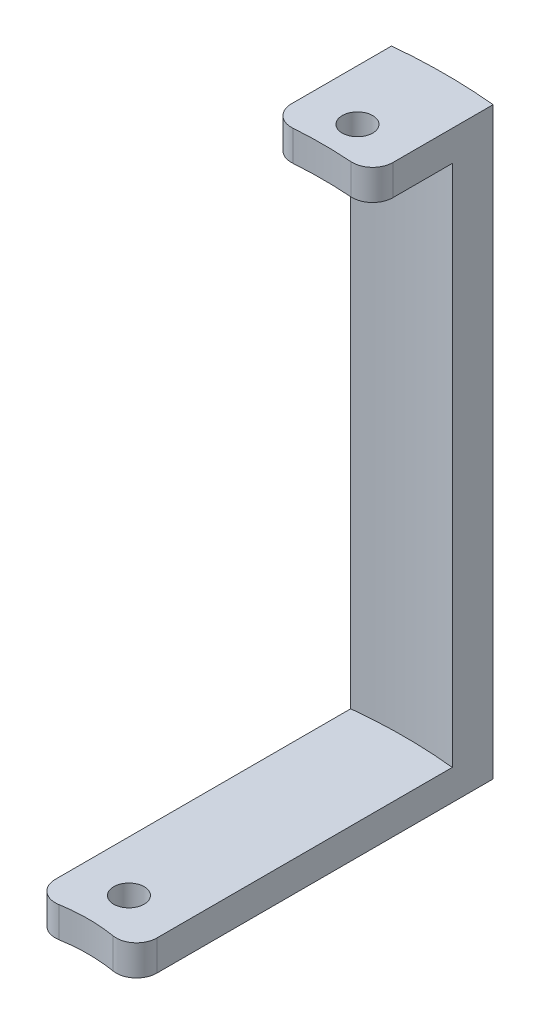
ISO-10303-21;
HEADER;
FILE_DESCRIPTION(('STEP AP214'),'2;1');
FILE_NAME('part.step','',(''),(''),'','','');
FILE_SCHEMA(('AUTOMOTIVE_DESIGN { 1 0 10303 214 1 1 1 1 }'));
ENDSEC;
DATA;
#1=APPLICATION_CONTEXT('core data for automotive mechanical design processes');
#2=APPLICATION_PROTOCOL_DEFINITION('international standard','automotive_design',2000,#1);
#3=PRODUCT_CONTEXT('',#1,'mechanical');
#4=PRODUCT('Part','Part','',(#3));
#5=PRODUCT_RELATED_PRODUCT_CATEGORY('part','',(#4));
#6=PRODUCT_DEFINITION_FORMATION('','',#4);
#7=PRODUCT_DEFINITION_CONTEXT('part definition',#1,'design');
#8=PRODUCT_DEFINITION('design','',#6,#7);
#9=PRODUCT_DEFINITION_SHAPE('','',#8);
#10=(LENGTH_UNIT() NAMED_UNIT(*) SI_UNIT(.MILLI.,.METRE.));
#11=(NAMED_UNIT(*) PLANE_ANGLE_UNIT() SI_UNIT($,.RADIAN.));
#12=(NAMED_UNIT(*) SI_UNIT($,.STERADIAN.) SOLID_ANGLE_UNIT());
#13=UNCERTAINTY_MEASURE_WITH_UNIT(LENGTH_MEASURE(1.E-05),#10,'distance_accuracy_value','');
#14=(GEOMETRIC_REPRESENTATION_CONTEXT(3) GLOBAL_UNCERTAINTY_ASSIGNED_CONTEXT((#13)) GLOBAL_UNIT_ASSIGNED_CONTEXT((#10,
#11,#12)) REPRESENTATION_CONTEXT('',''));
#15=CARTESIAN_POINT('',(0.,0.,0.));
#16=DIRECTION('',(0.,0.,1.));
#17=DIRECTION('',(1.,0.,0.));
#18=AXIS2_PLACEMENT_3D('',#15,#16,#17);
#19=CARTESIAN_POINT('',(0.,0.,0.));
#20=DIRECTION('',(0.,1.,0.));
#21=DIRECTION('',(0.,0.,1.));
#22=AXIS2_PLACEMENT_3D('',#19,#20,#21);
#23=PLANE('',#22);
#24=CARTESIAN_POINT('',(0.,0.,-20.));
#25=DIRECTION('',(0.,1.,0.));
#26=DIRECTION('',(0.,0.,1.));
#27=AXIS2_PLACEMENT_3D('',#24,#25,#26);
#28=CIRCLE('',#27,1.5);
#29=CARTESIAN_POINT('',(0.,0.,-18.5));
#30=VERTEX_POINT('',#29);
#31=EDGE_CURVE('E210',#30,#30,#28,.T.);
#32=ORIENTED_EDGE('',*,*,#31,.F.);
#33=EDGE_LOOP('',(#32));
#34=FACE_BOUND('',#33,.T.);
#35=CARTESIAN_POINT('',(0.,0.,0.));
#36=DIRECTION('',(0.,1.,0.));
#37=DIRECTION('',(0.,0.,1.));
#38=AXIS2_PLACEMENT_3D('',#35,#36,#37);
#39=CIRCLE('',#38,16.);
#40=CARTESIAN_POINT('',(-2.66666666666666,0.,-15.7762127549323));
#41=VERTEX_POINT('',#40);
#42=CARTESIAN_POINT('',(2.66666666666668,0.,-15.7762127549323));
#43=VERTEX_POINT('',#42);
#44=EDGE_CURVE('E224',#41,#43,#39,.F.);
#45=ORIENTED_EDGE('',*,*,#44,.T.);
#46=CARTESIAN_POINT('',(3.00000000000001,0.,-17.7482393492988));
#47=DIRECTION('',(0.,1.,0.));
#48=DIRECTION('',(0.,0.,1.));
#49=AXIS2_PLACEMENT_3D('',#46,#47,#48);
#50=CIRCLE('',#49,2.);
#51=CARTESIAN_POINT('',(5.00000000000001,0.,-17.7482393492988));
#52=VERTEX_POINT('',#51);
#53=EDGE_CURVE('E277',#43,#52,#50,.T.);
#54=ORIENTED_EDGE('',*,*,#53,.T.);
#55=DIRECTION('',(0.,0.,1.));
#56=VECTOR('',#55,1.);
#57=CARTESIAN_POINT('',(5.00000000000002,0.,0.));
#58=LINE('',#57,#56);
#59=CARTESIAN_POINT('',(5.,0.,-46.8338552758579));
#60=VERTEX_POINT('',#59);
#61=EDGE_CURVE('E228',#60,#52,#58,.T.);
#62=ORIENTED_EDGE('',*,*,#61,.F.);
#63=CARTESIAN_POINT('',(0.,0.,0.));
#64=DIRECTION('',(0.,1.,0.));
#65=DIRECTION('',(0.,0.,1.));
#66=AXIS2_PLACEMENT_3D('',#63,#64,#65);
#67=CIRCLE('',#66,47.1);
#68=CARTESIAN_POINT('',(-5.,0.,-46.8338552758579));
#69=VERTEX_POINT('',#68);
#70=EDGE_CURVE('E175',#60,#69,#67,.T.);
#71=ORIENTED_EDGE('',*,*,#70,.T.);
#72=DIRECTION('',(0.,0.,1.));
#73=VECTOR('',#72,1.);
#74=CARTESIAN_POINT('',(-4.99999999999998,0.,0.));
#75=LINE('',#74,#73);
#76=CARTESIAN_POINT('',(-4.99999999999999,0.,-17.7482393492989));
#77=VERTEX_POINT('',#76);
#78=EDGE_CURVE('E204',#69,#77,#75,.T.);
#79=ORIENTED_EDGE('',*,*,#78,.T.);
#80=CARTESIAN_POINT('',(-2.99999999999999,0.,-17.7482393492989));
#81=DIRECTION('',(0.,1.,0.));
#82=DIRECTION('',(0.,0.,1.));
#83=AXIS2_PLACEMENT_3D('',#80,#81,#82);
#84=CIRCLE('',#83,2.);
#85=EDGE_CURVE('E274',#77,#41,#84,.T.);
#86=ORIENTED_EDGE('',*,*,#85,.T.);
#87=EDGE_LOOP('',(#45,#54,#62,#71,#79,#86));
#88=FACE_BOUND('',#87,.T.);
#89=ADVANCED_FACE('F43',(#34,#88),#23,.T.);
#90=CARTESIAN_POINT('',(-4.99999999999998,-3.,0.));
#91=DIRECTION('',(-1.,0.,0.));
#92=DIRECTION('',(0.,0.,1.));
#93=AXIS2_PLACEMENT_3D('',#90,#91,#92);
#94=PLANE('',#93);
#95=DIRECTION('',(0.,0.,1.));
#96=VECTOR('',#95,1.);
#97=CARTESIAN_POINT('',(-4.99999999999998,51.5,0.));
#98=LINE('',#97,#96);
#99=CARTESIAN_POINT('',(-5.,51.5,-46.8338552758579));
#100=VERTEX_POINT('',#99);
#101=CARTESIAN_POINT('',(-5.,51.5,-40.9903647214806));
#102=VERTEX_POINT('',#101);
#103=EDGE_CURVE('E184',#100,#102,#98,.T.);
#104=ORIENTED_EDGE('',*,*,#103,.T.);
#105=DIRECTION('',(0.,-1.,0.));
#106=VECTOR('',#105,1.);
#107=CARTESIAN_POINT('',(-5.,-3.,-40.9903647214806));
#108=LINE('',#107,#106);
#109=CARTESIAN_POINT('',(-5.,54.5,-40.9903647214806));
#110=VERTEX_POINT('',#109);
#111=EDGE_CURVE('E254',#102,#110,#108,.F.);
#112=ORIENTED_EDGE('',*,*,#111,.T.);
#113=DIRECTION('',(0.,0.,1.));
#114=VECTOR('',#113,1.);
#115=CARTESIAN_POINT('',(-4.99999999999998,54.5,0.));
#116=LINE('',#115,#114);
#117=CARTESIAN_POINT('',(-5.00000000000001,54.5,-50.8547932844093));
#118=VERTEX_POINT('',#117);
#119=EDGE_CURVE('E155',#118,#110,#116,.T.);
#120=ORIENTED_EDGE('',*,*,#119,.F.);
#121=DIRECTION('',(0.,1.,0.));
#122=VECTOR('',#121,1.);
#123=CARTESIAN_POINT('',(-5.00000000000001,-3.,-50.8547932844093));
#124=LINE('',#123,#122);
#125=CARTESIAN_POINT('',(-5.00000000000001,-3.,-50.8547932844093));
#126=VERTEX_POINT('',#125);
#127=EDGE_CURVE('E145',#126,#118,#124,.T.);
#128=ORIENTED_EDGE('',*,*,#127,.F.);
#129=DIRECTION('',(0.,0.,1.));
#130=VECTOR('',#129,1.);
#131=CARTESIAN_POINT('',(-4.99999999999998,-3.,0.));
#132=LINE('',#131,#130);
#133=CARTESIAN_POINT('',(-4.99999999999999,-3.,-17.7482393492989));
#134=VERTEX_POINT('',#133);
#135=EDGE_CURVE('E205',#126,#134,#132,.T.);
#136=ORIENTED_EDGE('',*,*,#135,.T.);
#137=DIRECTION('',(0.,1.,0.));
#138=VECTOR('',#137,1.);
#139=CARTESIAN_POINT('',(-4.99999999999999,-3.,-17.7482393492989));
#140=LINE('',#139,#138);
#141=EDGE_CURVE('E250',#134,#77,#140,.T.);
#142=ORIENTED_EDGE('',*,*,#141,.T.);
#143=ORIENTED_EDGE('',*,*,#78,.F.);
#144=DIRECTION('',(0.,-1.,0.));
#145=VECTOR('',#144,1.);
#146=CARTESIAN_POINT('',(-5.,51.5,-46.8338552758579));
#147=LINE('',#146,#145);
#148=EDGE_CURVE('E195',#100,#69,#147,.T.);
#149=ORIENTED_EDGE('',*,*,#148,.F.);
#150=EDGE_LOOP('',(#104,#112,#120,#128,#136,#142,#143,#149));
#151=FACE_BOUND('',#150,.T.);
#152=ADVANCED_FACE('F287',(#151),#94,.T.);
#153=CARTESIAN_POINT('',(0.,-3.,0.));
#154=DIRECTION('',(0.,1.,0.));
#155=DIRECTION('',(0.,0.,1.));
#156=AXIS2_PLACEMENT_3D('',#153,#154,#155);
#157=CYLINDRICAL_SURFACE('',#156,51.1);
#158=ORIENTED_EDGE('',*,*,#127,.T.);
#159=CARTESIAN_POINT('',(0.,54.5,0.));
#160=DIRECTION('',(0.,1.,0.));
#161=DIRECTION('',(0.,0.,1.));
#162=AXIS2_PLACEMENT_3D('',#159,#160,#161);
#163=CIRCLE('',#162,51.1);
#164=CARTESIAN_POINT('',(4.99999999999999,54.5,-50.8547932844093));
#165=VERTEX_POINT('',#164);
#166=EDGE_CURVE('E149',#165,#118,#163,.T.);
#167=ORIENTED_EDGE('',*,*,#166,.F.);
#168=DIRECTION('',(0.,1.,0.));
#169=VECTOR('',#168,1.);
#170=CARTESIAN_POINT('',(4.99999999999999,-3.,-50.8547932844093));
#171=LINE('',#170,#169);
#172=CARTESIAN_POINT('',(4.99999999999999,-3.,-50.8547932844093));
#173=VERTEX_POINT('',#172);
#174=EDGE_CURVE('E133',#173,#165,#171,.T.);
#175=ORIENTED_EDGE('',*,*,#174,.F.);
#176=CARTESIAN_POINT('',(0.,-3.,0.));
#177=DIRECTION('',(0.,1.,0.));
#178=DIRECTION('',(0.,0.,1.));
#179=AXIS2_PLACEMENT_3D('',#176,#177,#178);
#180=CIRCLE('',#179,51.1);
#181=EDGE_CURVE('E215',#173,#126,#180,.T.);
#182=ORIENTED_EDGE('',*,*,#181,.T.);
#183=EDGE_LOOP('',(#158,#167,#175,#182));
#184=FACE_BOUND('',#183,.T.);
#185=ADVANCED_FACE('F150',(#184),#157,.T.);
#186=CARTESIAN_POINT('',(5.00000000000002,-3.,0.));
#187=DIRECTION('',(-1.,0.,0.));
#188=DIRECTION('',(0.,0.,1.));
#189=AXIS2_PLACEMENT_3D('',#186,#187,#188);
#190=PLANE('',#189);
#191=DIRECTION('',(0.,0.,1.));
#192=VECTOR('',#191,1.);
#193=CARTESIAN_POINT('',(5.00000000000002,54.5,0.));
#194=LINE('',#193,#192);
#195=CARTESIAN_POINT('',(5.,54.5,-40.9903647214806));
#196=VERTEX_POINT('',#195);
#197=EDGE_CURVE('E138',#165,#196,#194,.T.);
#198=ORIENTED_EDGE('',*,*,#197,.T.);
#199=DIRECTION('',(0.,1.,0.));
#200=VECTOR('',#199,1.);
#201=CARTESIAN_POINT('',(5.,51.5,-40.9903647214806));
#202=LINE('',#201,#200);
#203=CARTESIAN_POINT('',(5.,51.5,-40.9903647214806));
#204=VERTEX_POINT('',#203);
#205=EDGE_CURVE('E265',#196,#204,#202,.F.);
#206=ORIENTED_EDGE('',*,*,#205,.T.);
#207=DIRECTION('',(0.,0.,1.));
#208=VECTOR('',#207,1.);
#209=CARTESIAN_POINT('',(5.00000000000002,51.5,0.));
#210=LINE('',#209,#208);
#211=CARTESIAN_POINT('',(5.,51.5,-46.8338552758579));
#212=VERTEX_POINT('',#211);
#213=EDGE_CURVE('E180',#212,#204,#210,.T.);
#214=ORIENTED_EDGE('',*,*,#213,.F.);
#215=DIRECTION('',(0.,-1.,0.));
#216=VECTOR('',#215,1.);
#217=CARTESIAN_POINT('',(5.,51.5,-46.8338552758579));
#218=LINE('',#217,#216);
#219=EDGE_CURVE('E201',#212,#60,#218,.T.);
#220=ORIENTED_EDGE('',*,*,#219,.T.);
#221=ORIENTED_EDGE('',*,*,#61,.T.);
#222=DIRECTION('',(0.,-1.,0.));
#223=VECTOR('',#222,1.);
#224=CARTESIAN_POINT('',(5.00000000000001,-3.,-17.7482393492988));
#225=LINE('',#224,#223);
#226=CARTESIAN_POINT('',(5.00000000000001,-3.,-17.7482393492988));
#227=VERTEX_POINT('',#226);
#228=EDGE_CURVE('E262',#52,#227,#225,.T.);
#229=ORIENTED_EDGE('',*,*,#228,.T.);
#230=DIRECTION('',(0.,0.,1.));
#231=VECTOR('',#230,1.);
#232=CARTESIAN_POINT('',(5.00000000000002,-3.,0.));
#233=LINE('',#232,#231);
#234=EDGE_CURVE('E140',#173,#227,#233,.T.);
#235=ORIENTED_EDGE('',*,*,#234,.F.);
#236=ORIENTED_EDGE('',*,*,#174,.T.);
#237=EDGE_LOOP('',(#198,#206,#214,#220,#221,#229,#235,#236));
#238=FACE_BOUND('',#237,.T.);
#239=ADVANCED_FACE('F135',(#238),#190,.F.);
#240=CARTESIAN_POINT('',(0.,-3.,0.));
#241=DIRECTION('',(0.,1.,0.));
#242=DIRECTION('',(0.,0.,1.));
#243=AXIS2_PLACEMENT_3D('',#240,#241,#242);
#244=CYLINDRICAL_SURFACE('',#243,16.);
#245=CARTESIAN_POINT('',(0.,-3.,0.));
#246=DIRECTION('',(0.,1.,0.));
#247=DIRECTION('',(0.,0.,1.));
#248=AXIS2_PLACEMENT_3D('',#245,#246,#247);
#249=CIRCLE('',#248,16.);
#250=CARTESIAN_POINT('',(-2.66666666666666,-3.,-15.7762127549323));
#251=VERTEX_POINT('',#250);
#252=CARTESIAN_POINT('',(2.66666666666668,-3.,-15.7762127549323));
#253=VERTEX_POINT('',#252);
#254=EDGE_CURVE('E209',#251,#253,#249,.F.);
#255=ORIENTED_EDGE('',*,*,#254,.T.);
#256=DIRECTION('',(0.,1.,0.));
#257=VECTOR('',#256,1.);
#258=CARTESIAN_POINT('',(2.66666666666667,-3.,-15.7762127549323));
#259=LINE('',#258,#257);
#260=EDGE_CURVE('E270',#253,#43,#259,.T.);
#261=ORIENTED_EDGE('',*,*,#260,.T.);
#262=ORIENTED_EDGE('',*,*,#44,.F.);
#263=DIRECTION('',(0.,1.,0.));
#264=VECTOR('',#263,1.);
#265=CARTESIAN_POINT('',(-2.66666666666666,-3.,-15.7762127549323));
#266=LINE('',#265,#264);
#267=EDGE_CURVE('E64',#41,#251,#266,.F.);
#268=ORIENTED_EDGE('',*,*,#267,.T.);
#269=EDGE_LOOP('',(#255,#261,#262,#268));
#270=FACE_BOUND('',#269,.T.);
#271=ADVANCED_FACE('F290',(#270),#244,.F.);
#272=CARTESIAN_POINT('',(0.,-3.,-20.));
#273=DIRECTION('',(0.,1.,0.));
#274=DIRECTION('',(0.,0.,1.));
#275=AXIS2_PLACEMENT_3D('',#272,#273,#274);
#276=CYLINDRICAL_SURFACE('',#275,1.5);
#277=CARTESIAN_POINT('',(0.,-3.,-20.));
#278=DIRECTION('',(0.,1.,0.));
#279=DIRECTION('',(0.,0.,1.));
#280=AXIS2_PLACEMENT_3D('',#277,#278,#279);
#281=CIRCLE('',#280,1.5);
#282=CARTESIAN_POINT('',(0.,-3.,-18.5));
#283=VERTEX_POINT('',#282);
#284=EDGE_CURVE('E146',#283,#283,#281,.T.);
#285=ORIENTED_EDGE('',*,*,#284,.F.);
#286=EDGE_LOOP('',(#285));
#287=FACE_BOUND('',#286,.T.);
#288=ORIENTED_EDGE('',*,*,#31,.T.);
#289=EDGE_LOOP('',(#288));
#290=FACE_BOUND('',#289,.T.);
#291=ADVANCED_FACE('F333',(#287,#290),#276,.F.);
#292=CARTESIAN_POINT('',(0.,-3.,0.));
#293=DIRECTION('',(0.,1.,0.));
#294=DIRECTION('',(0.,0.,1.));
#295=AXIS2_PLACEMENT_3D('',#292,#293,#294);
#296=PLANE('',#295);
#297=ORIENTED_EDGE('',*,*,#234,.T.);
#298=CARTESIAN_POINT('',(3.00000000000001,-3.,-17.7482393492988));
#299=DIRECTION('',(0.,1.,0.));
#300=DIRECTION('',(0.,0.,1.));
#301=AXIS2_PLACEMENT_3D('',#298,#299,#300);
#302=CIRCLE('',#301,2.);
#303=EDGE_CURVE('E11',#227,#253,#302,.F.);
#304=ORIENTED_EDGE('',*,*,#303,.T.);
#305=ORIENTED_EDGE('',*,*,#254,.F.);
#306=CARTESIAN_POINT('',(-2.99999999999999,-3.,-17.7482393492989));
#307=DIRECTION('',(0.,1.,0.));
#308=DIRECTION('',(0.,0.,1.));
#309=AXIS2_PLACEMENT_3D('',#306,#307,#308);
#310=CIRCLE('',#309,2.);
#311=EDGE_CURVE('E52',#251,#134,#310,.F.);
#312=ORIENTED_EDGE('',*,*,#311,.T.);
#313=ORIENTED_EDGE('',*,*,#135,.F.);
#314=ORIENTED_EDGE('',*,*,#181,.F.);
#315=EDGE_LOOP('',(#297,#304,#305,#312,#313,#314));
#316=FACE_BOUND('',#315,.T.);
#317=ORIENTED_EDGE('',*,*,#284,.T.);
#318=EDGE_LOOP('',(#317));
#319=FACE_BOUND('',#318,.T.);
#320=ADVANCED_FACE('F282',(#316,#319),#296,.F.);
#321=CARTESIAN_POINT('',(0.,51.5,0.));
#322=DIRECTION('',(0.,-1.,0.));
#323=DIRECTION('',(0.,0.,-1.));
#324=AXIS2_PLACEMENT_3D('',#321,#322,#323);
#325=CYLINDRICAL_SURFACE('',#324,47.1);
#326=ORIENTED_EDGE('',*,*,#70,.F.);
#327=ORIENTED_EDGE('',*,*,#219,.F.);
#328=CARTESIAN_POINT('',(0.,51.5,0.));
#329=DIRECTION('',(0.,1.,0.));
#330=DIRECTION('',(0.,0.,1.));
#331=AXIS2_PLACEMENT_3D('',#328,#329,#330);
#332=CIRCLE('',#331,47.1);
#333=EDGE_CURVE('E191',#212,#100,#332,.T.);
#334=ORIENTED_EDGE('',*,*,#333,.T.);
#335=ORIENTED_EDGE('',*,*,#148,.T.);
#336=EDGE_LOOP('',(#326,#327,#334,#335));
#337=FACE_BOUND('',#336,.T.);
#338=ADVANCED_FACE('F300',(#337),#325,.F.);
#339=CARTESIAN_POINT('',(0.,51.5,0.));
#340=DIRECTION('',(0.,1.,0.));
#341=DIRECTION('',(0.,0.,1.));
#342=AXIS2_PLACEMENT_3D('',#339,#340,#341);
#343=PLANE('',#342);
#344=CARTESIAN_POINT('',(0.,51.5,-42.5));
#345=DIRECTION('',(0.,1.,0.));
#346=DIRECTION('',(0.,0.,1.));
#347=AXIS2_PLACEMENT_3D('',#344,#345,#346);
#348=CIRCLE('',#347,1.5);
#349=CARTESIAN_POINT('',(0.,51.5,-41.));
#350=VERTEX_POINT('',#349);
#351=EDGE_CURVE('E176',#350,#350,#348,.T.);
#352=ORIENTED_EDGE('',*,*,#351,.T.);
#353=EDGE_LOOP('',(#352));
#354=FACE_BOUND('',#353,.T.);
#355=CARTESIAN_POINT('',(0.,51.5,0.));
#356=DIRECTION('',(0.,1.,0.));
#357=DIRECTION('',(0.,0.,1.));
#358=AXIS2_PLACEMENT_3D('',#355,#356,#357);
#359=CIRCLE('',#358,39.1);
#360=CARTESIAN_POINT('',(2.85401459854014,51.5,-38.9956997715302));
#361=VERTEX_POINT('',#360);
#362=CARTESIAN_POINT('',(-2.85401459854015,51.5,-38.9956997715302));
#363=VERTEX_POINT('',#362);
#364=EDGE_CURVE('E166',#361,#363,#359,.T.);
#365=ORIENTED_EDGE('',*,*,#364,.T.);
#366=CARTESIAN_POINT('',(-3.,51.5,-40.9903647214806));
#367=DIRECTION('',(0.,1.,0.));
#368=DIRECTION('',(0.,0.,1.));
#369=AXIS2_PLACEMENT_3D('',#366,#367,#368);
#370=CIRCLE('',#369,2.);
#371=EDGE_CURVE('E247',#363,#102,#370,.F.);
#372=ORIENTED_EDGE('',*,*,#371,.T.);
#373=ORIENTED_EDGE('',*,*,#103,.F.);
#374=ORIENTED_EDGE('',*,*,#333,.F.);
#375=ORIENTED_EDGE('',*,*,#213,.T.);
#376=CARTESIAN_POINT('',(3.,51.5,-40.9903647214806));
#377=DIRECTION('',(0.,1.,0.));
#378=DIRECTION('',(0.,0.,1.));
#379=AXIS2_PLACEMENT_3D('',#376,#377,#378);
#380=CIRCLE('',#379,2.);
#381=EDGE_CURVE('E244',#204,#361,#380,.F.);
#382=ORIENTED_EDGE('',*,*,#381,.T.);
#383=EDGE_LOOP('',(#365,#372,#373,#374,#375,#382));
#384=FACE_BOUND('',#383,.T.);
#385=ADVANCED_FACE('F304',(#354,#384),#343,.F.);
#386=CARTESIAN_POINT('',(0.,54.5,-42.5));
#387=DIRECTION('',(0.,-1.,0.));
#388=DIRECTION('',(0.,0.,-1.));
#389=AXIS2_PLACEMENT_3D('',#386,#387,#388);
#390=CYLINDRICAL_SURFACE('',#389,1.5);
#391=CARTESIAN_POINT('',(0.,54.5,-42.5));
#392=DIRECTION('',(0.,1.,0.));
#393=DIRECTION('',(0.,0.,1.));
#394=AXIS2_PLACEMENT_3D('',#391,#392,#393);
#395=CIRCLE('',#394,1.5);
#396=CARTESIAN_POINT('',(0.,54.5,-41.));
#397=VERTEX_POINT('',#396);
#398=EDGE_CURVE('E162',#397,#397,#395,.T.);
#399=ORIENTED_EDGE('',*,*,#398,.T.);
#400=EDGE_LOOP('',(#399));
#401=FACE_BOUND('',#400,.T.);
#402=ORIENTED_EDGE('',*,*,#351,.F.);
#403=EDGE_LOOP('',(#402));
#404=FACE_BOUND('',#403,.T.);
#405=ADVANCED_FACE('F368',(#401,#404),#390,.F.);
#406=CARTESIAN_POINT('',(0.,54.5,0.));
#407=DIRECTION('',(0.,-1.,0.));
#408=DIRECTION('',(0.,0.,-1.));
#409=AXIS2_PLACEMENT_3D('',#406,#407,#408);
#410=CYLINDRICAL_SURFACE('',#409,39.1);
#411=CARTESIAN_POINT('',(0.,54.5,0.));
#412=DIRECTION('',(0.,1.,0.));
#413=DIRECTION('',(0.,0.,1.));
#414=AXIS2_PLACEMENT_3D('',#411,#412,#413);
#415=CIRCLE('',#414,39.1);
#416=CARTESIAN_POINT('',(2.85401459854014,54.5,-38.9956997715302));
#417=VERTEX_POINT('',#416);
#418=CARTESIAN_POINT('',(-2.85401459854015,54.5,-38.9956997715302));
#419=VERTEX_POINT('',#418);
#420=EDGE_CURVE('E171',#417,#419,#415,.T.);
#421=ORIENTED_EDGE('',*,*,#420,.T.);
#422=DIRECTION('',(0.,-1.,0.));
#423=VECTOR('',#422,1.);
#424=CARTESIAN_POINT('',(-2.85401459854015,54.5,-38.9956997715302));
#425=LINE('',#424,#423);
#426=EDGE_CURVE('E240',#419,#363,#425,.T.);
#427=ORIENTED_EDGE('',*,*,#426,.T.);
#428=ORIENTED_EDGE('',*,*,#364,.F.);
#429=DIRECTION('',(0.,-1.,0.));
#430=VECTOR('',#429,1.);
#431=CARTESIAN_POINT('',(2.85401459854014,54.5,-38.9956997715302));
#432=LINE('',#431,#430);
#433=EDGE_CURVE('E236',#361,#417,#432,.F.);
#434=ORIENTED_EDGE('',*,*,#433,.T.);
#435=EDGE_LOOP('',(#421,#427,#428,#434));
#436=FACE_BOUND('',#435,.T.);
#437=ADVANCED_FACE('F311',(#436),#410,.F.);
#438=CARTESIAN_POINT('',(0.,54.5,0.));
#439=DIRECTION('',(0.,1.,0.));
#440=DIRECTION('',(0.,0.,1.));
#441=AXIS2_PLACEMENT_3D('',#438,#439,#440);
#442=PLANE('',#441);
#443=ORIENTED_EDGE('',*,*,#398,.F.);
#444=EDGE_LOOP('',(#443));
#445=FACE_BOUND('',#444,.T.);
#446=ORIENTED_EDGE('',*,*,#119,.T.);
#447=CARTESIAN_POINT('',(-3.,54.5,-40.9903647214806));
#448=DIRECTION('',(0.,1.,0.));
#449=DIRECTION('',(0.,0.,1.));
#450=AXIS2_PLACEMENT_3D('',#447,#448,#449);
#451=CIRCLE('',#450,2.);
#452=EDGE_CURVE('E259',#110,#419,#451,.T.);
#453=ORIENTED_EDGE('',*,*,#452,.T.);
#454=ORIENTED_EDGE('',*,*,#420,.F.);
#455=CARTESIAN_POINT('',(3.,54.5,-40.9903647214806));
#456=DIRECTION('',(0.,1.,0.));
#457=DIRECTION('',(0.,0.,1.));
#458=AXIS2_PLACEMENT_3D('',#455,#456,#457);
#459=CIRCLE('',#458,2.);
#460=EDGE_CURVE('E160',#417,#196,#459,.T.);
#461=ORIENTED_EDGE('',*,*,#460,.T.);
#462=ORIENTED_EDGE('',*,*,#197,.F.);
#463=ORIENTED_EDGE('',*,*,#166,.T.);
#464=EDGE_LOOP('',(#446,#453,#454,#461,#462,#463));
#465=FACE_BOUND('',#464,.T.);
#466=ADVANCED_FACE('F157',(#445,#465),#442,.T.);
#467=CARTESIAN_POINT('',(-3.,54.5,-40.9903647214806));
#468=DIRECTION('',(0.,-1.,0.));
#469=DIRECTION('',(0.,0.,-1.));
#470=AXIS2_PLACEMENT_3D('',#467,#468,#469);
#471=CYLINDRICAL_SURFACE('',#470,2.);
#472=ORIENTED_EDGE('',*,*,#452,.F.);
#473=ORIENTED_EDGE('',*,*,#111,.F.);
#474=ORIENTED_EDGE('',*,*,#371,.F.);
#475=ORIENTED_EDGE('',*,*,#426,.F.);
#476=EDGE_LOOP('',(#472,#473,#474,#475));
#477=FACE_BOUND('',#476,.T.);
#478=ADVANCED_FACE('F309',(#477),#471,.T.);
#479=CARTESIAN_POINT('',(3.,54.5,-40.9903647214806));
#480=DIRECTION('',(0.,-1.,0.));
#481=DIRECTION('',(0.,0.,-1.));
#482=AXIS2_PLACEMENT_3D('',#479,#480,#481);
#483=CYLINDRICAL_SURFACE('',#482,2.);
#484=ORIENTED_EDGE('',*,*,#460,.F.);
#485=ORIENTED_EDGE('',*,*,#433,.F.);
#486=ORIENTED_EDGE('',*,*,#381,.F.);
#487=ORIENTED_EDGE('',*,*,#205,.F.);
#488=EDGE_LOOP('',(#484,#485,#486,#487));
#489=FACE_BOUND('',#488,.T.);
#490=ADVANCED_FACE('F314',(#489),#483,.T.);
#491=CARTESIAN_POINT('',(3.00000000000001,-3.,-17.7482393492988));
#492=DIRECTION('',(0.,1.,0.));
#493=DIRECTION('',(0.,0.,1.));
#494=AXIS2_PLACEMENT_3D('',#491,#492,#493);
#495=CYLINDRICAL_SURFACE('',#494,2.);
#496=ORIENTED_EDGE('',*,*,#303,.F.);
#497=ORIENTED_EDGE('',*,*,#228,.F.);
#498=ORIENTED_EDGE('',*,*,#53,.F.);
#499=ORIENTED_EDGE('',*,*,#260,.F.);
#500=EDGE_LOOP('',(#496,#497,#498,#499));
#501=FACE_BOUND('',#500,.T.);
#502=ADVANCED_FACE('F293',(#501),#495,.T.);
#503=CARTESIAN_POINT('',(-2.99999999999999,-3.,-17.7482393492989));
#504=DIRECTION('',(0.,1.,0.));
#505=DIRECTION('',(0.,0.,1.));
#506=AXIS2_PLACEMENT_3D('',#503,#504,#505);
#507=CYLINDRICAL_SURFACE('',#506,2.);
#508=ORIENTED_EDGE('',*,*,#311,.F.);
#509=ORIENTED_EDGE('',*,*,#267,.F.);
#510=ORIENTED_EDGE('',*,*,#85,.F.);
#511=ORIENTED_EDGE('',*,*,#141,.F.);
#512=EDGE_LOOP('',(#508,#509,#510,#511));
#513=FACE_BOUND('',#512,.T.);
#514=ADVANCED_FACE('F45',(#513),#507,.T.);
#515=CLOSED_SHELL('',(#89,#152,#185,#239,#271,#291,#320,#338,#385,#405,#437,#466,#478,#490,#502,#514));
#516=MANIFOLD_SOLID_BREP('B2',#515);
#517=ADVANCED_BREP_SHAPE_REPRESENTATION('',(#18,#516),#14);
#518=SHAPE_DEFINITION_REPRESENTATION(#9,#517);
ENDSEC;
END-ISO-10303-21;
